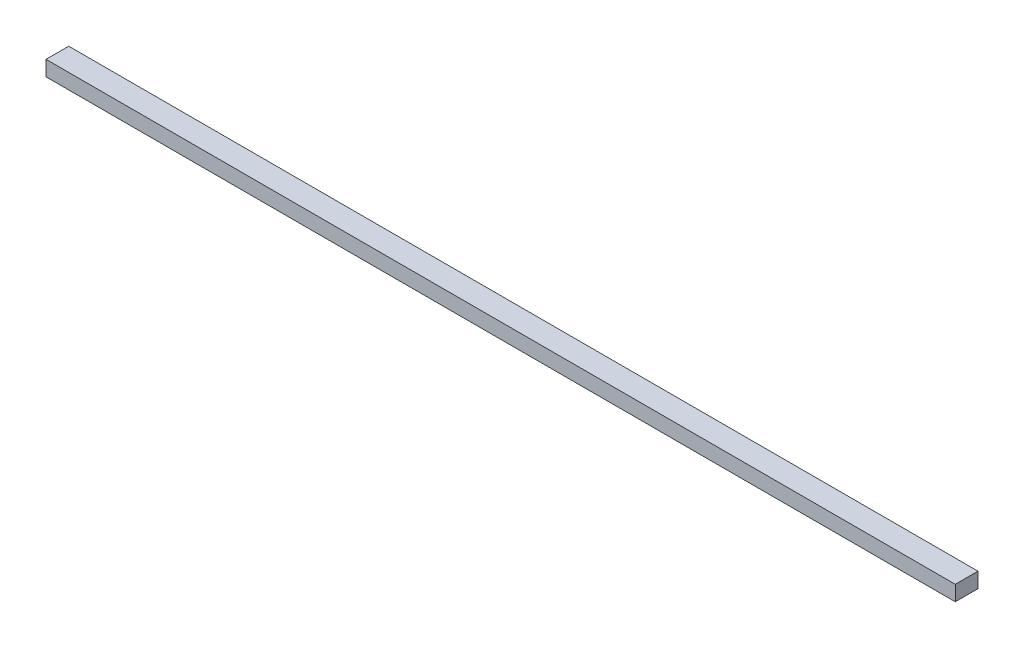
ISO-10303-21;
HEADER;
FILE_DESCRIPTION(('STEP AP214'),'2;1');
FILE_NAME('part.step','',(''),(''),'','','');
FILE_SCHEMA(('AUTOMOTIVE_DESIGN { 1 0 10303 214 1 1 1 1 }'));
ENDSEC;
DATA;
#1=APPLICATION_CONTEXT('core data for automotive mechanical design processes');
#2=APPLICATION_PROTOCOL_DEFINITION('international standard','automotive_design',2000,#1);
#3=PRODUCT_CONTEXT('',#1,'mechanical');
#4=PRODUCT('Part','Part','',(#3));
#5=PRODUCT_RELATED_PRODUCT_CATEGORY('part','',(#4));
#6=PRODUCT_DEFINITION_FORMATION('','',#4);
#7=PRODUCT_DEFINITION_CONTEXT('part definition',#1,'design');
#8=PRODUCT_DEFINITION('design','',#6,#7);
#9=PRODUCT_DEFINITION_SHAPE('','',#8);
#10=(LENGTH_UNIT() NAMED_UNIT(*) SI_UNIT(.MILLI.,.METRE.));
#11=(NAMED_UNIT(*) PLANE_ANGLE_UNIT() SI_UNIT($,.RADIAN.));
#12=(NAMED_UNIT(*) SI_UNIT($,.STERADIAN.) SOLID_ANGLE_UNIT());
#13=UNCERTAINTY_MEASURE_WITH_UNIT(LENGTH_MEASURE(1.E-05),#10,'distance_accuracy_value','');
#14=(GEOMETRIC_REPRESENTATION_CONTEXT(3) GLOBAL_UNCERTAINTY_ASSIGNED_CONTEXT((#13)) GLOBAL_UNIT_ASSIGNED_CONTEXT((#10,
#11,#12)) REPRESENTATION_CONTEXT('',''));
#15=CARTESIAN_POINT('',(0.,0.,0.));
#16=DIRECTION('',(0.,0.,1.));
#17=DIRECTION('',(1.,0.,0.));
#18=AXIS2_PLACEMENT_3D('',#15,#16,#17);
#19=CARTESIAN_POINT('',(0.,10.,0.));
#20=DIRECTION('',(1.,0.,0.));
#21=DIRECTION('',(0.,0.,-1.));
#22=AXIS2_PLACEMENT_3D('',#19,#20,#21);
#23=PLANE('',#22);
#24=DIRECTION('',(0.,0.,1.));
#25=VECTOR('',#24,1.);
#26=CARTESIAN_POINT('',(0.,0.,0.));
#27=LINE('',#26,#25);
#28=CARTESIAN_POINT('',(0.,0.,0.));
#29=VERTEX_POINT('',#28);
#30=CARTESIAN_POINT('',(0.,0.,15.));
#31=VERTEX_POINT('',#30);
#32=EDGE_CURVE('E107',#29,#31,#27,.T.);
#33=ORIENTED_EDGE('',*,*,#32,.T.);
#34=DIRECTION('',(0.,-1.,0.));
#35=VECTOR('',#34,1.);
#36=CARTESIAN_POINT('',(0.,10.,15.));
#37=LINE('',#36,#35);
#38=CARTESIAN_POINT('',(0.,10.,15.));
#39=VERTEX_POINT('',#38);
#40=EDGE_CURVE('E11',#39,#31,#37,.T.);
#41=ORIENTED_EDGE('',*,*,#40,.F.);
#42=DIRECTION('',(0.,0.,1.));
#43=VECTOR('',#42,1.);
#44=CARTESIAN_POINT('',(0.,10.,0.));
#45=LINE('',#44,#43);
#46=CARTESIAN_POINT('',(0.,10.,0.));
#47=VERTEX_POINT('',#46);
#48=EDGE_CURVE('E91',#47,#39,#45,.T.);
#49=ORIENTED_EDGE('',*,*,#48,.F.);
#50=DIRECTION('',(0.,-1.,0.));
#51=VECTOR('',#50,1.);
#52=CARTESIAN_POINT('',(0.,10.,0.));
#53=LINE('',#52,#51);
#54=EDGE_CURVE('E103',#47,#29,#53,.T.);
#55=ORIENTED_EDGE('',*,*,#54,.T.);
#56=EDGE_LOOP('',(#33,#41,#49,#55));
#57=FACE_BOUND('',#56,.T.);
#58=ADVANCED_FACE('F39',(#57),#23,.F.);
#59=CARTESIAN_POINT('',(0.,10.,15.));
#60=DIRECTION('',(0.,0.,-1.));
#61=DIRECTION('',(-1.,0.,0.));
#62=AXIS2_PLACEMENT_3D('',#59,#60,#61);
#63=PLANE('',#62);
#64=DIRECTION('',(1.,0.,0.));
#65=VECTOR('',#64,1.);
#66=CARTESIAN_POINT('',(0.,0.,15.));
#67=LINE('',#66,#65);
#68=CARTESIAN_POINT('',(600.,0.,15.));
#69=VERTEX_POINT('',#68);
#70=EDGE_CURVE('E96',#31,#69,#67,.T.);
#71=ORIENTED_EDGE('',*,*,#70,.T.);
#72=DIRECTION('',(0.,-1.,0.));
#73=VECTOR('',#72,1.);
#74=CARTESIAN_POINT('',(600.,10.,15.));
#75=LINE('',#74,#73);
#76=CARTESIAN_POINT('',(600.,10.,15.));
#77=VERTEX_POINT('',#76);
#78=EDGE_CURVE('E48',#77,#69,#75,.T.);
#79=ORIENTED_EDGE('',*,*,#78,.F.);
#80=DIRECTION('',(1.,0.,0.));
#81=VECTOR('',#80,1.);
#82=CARTESIAN_POINT('',(0.,10.,15.));
#83=LINE('',#82,#81);
#84=EDGE_CURVE('E86',#39,#77,#83,.T.);
#85=ORIENTED_EDGE('',*,*,#84,.F.);
#86=ORIENTED_EDGE('',*,*,#40,.T.);
#87=EDGE_LOOP('',(#71,#79,#85,#86));
#88=FACE_BOUND('',#87,.T.);
#89=ADVANCED_FACE('F95',(#88),#63,.F.);
#90=CARTESIAN_POINT('',(600.,10.,0.));
#91=DIRECTION('',(-1.,0.,0.));
#92=DIRECTION('',(0.,0.,1.));
#93=AXIS2_PLACEMENT_3D('',#90,#91,#92);
#94=PLANE('',#93);
#95=DIRECTION('',(0.,0.,-1.));
#96=VECTOR('',#95,1.);
#97=CARTESIAN_POINT('',(600.,0.,0.));
#98=LINE('',#97,#96);
#99=CARTESIAN_POINT('',(600.,0.,0.));
#100=VERTEX_POINT('',#99);
#101=EDGE_CURVE('E73',#69,#100,#98,.T.);
#102=ORIENTED_EDGE('',*,*,#101,.T.);
#103=DIRECTION('',(0.,-1.,0.));
#104=VECTOR('',#103,1.);
#105=CARTESIAN_POINT('',(600.,10.,0.));
#106=LINE('',#105,#104);
#107=CARTESIAN_POINT('',(600.,10.,0.));
#108=VERTEX_POINT('',#107);
#109=EDGE_CURVE('E98',#108,#100,#106,.T.);
#110=ORIENTED_EDGE('',*,*,#109,.F.);
#111=DIRECTION('',(0.,0.,-1.));
#112=VECTOR('',#111,1.);
#113=CARTESIAN_POINT('',(600.,10.,0.));
#114=LINE('',#113,#112);
#115=EDGE_CURVE('E89',#77,#108,#114,.T.);
#116=ORIENTED_EDGE('',*,*,#115,.F.);
#117=ORIENTED_EDGE('',*,*,#78,.T.);
#118=EDGE_LOOP('',(#102,#110,#116,#117));
#119=FACE_BOUND('',#118,.T.);
#120=ADVANCED_FACE('F99',(#119),#94,.F.);
#121=CARTESIAN_POINT('',(0.,10.,0.));
#122=DIRECTION('',(0.,0.,1.));
#123=DIRECTION('',(1.,0.,0.));
#124=AXIS2_PLACEMENT_3D('',#121,#122,#123);
#125=PLANE('',#124);
#126=DIRECTION('',(-1.,0.,0.));
#127=VECTOR('',#126,1.);
#128=CARTESIAN_POINT('',(0.,0.,0.));
#129=LINE('',#128,#127);
#130=EDGE_CURVE('E79',#100,#29,#129,.T.);
#131=ORIENTED_EDGE('',*,*,#130,.T.);
#132=ORIENTED_EDGE('',*,*,#54,.F.);
#133=DIRECTION('',(-1.,0.,0.));
#134=VECTOR('',#133,1.);
#135=CARTESIAN_POINT('',(0.,10.,0.));
#136=LINE('',#135,#134);
#137=EDGE_CURVE('E56',#108,#47,#136,.T.);
#138=ORIENTED_EDGE('',*,*,#137,.F.);
#139=ORIENTED_EDGE('',*,*,#109,.T.);
#140=EDGE_LOOP('',(#131,#132,#138,#139));
#141=FACE_BOUND('',#140,.T.);
#142=ADVANCED_FACE('F120',(#141),#125,.F.);
#143=CARTESIAN_POINT('',(0.,10.,0.));
#144=DIRECTION('',(0.,1.,0.));
#145=DIRECTION('',(0.,0.,1.));
#146=AXIS2_PLACEMENT_3D('',#143,#144,#145);
#147=PLANE('',#146);
#148=ORIENTED_EDGE('',*,*,#48,.T.);
#149=ORIENTED_EDGE('',*,*,#84,.T.);
#150=ORIENTED_EDGE('',*,*,#115,.T.);
#151=ORIENTED_EDGE('',*,*,#137,.T.);
#152=EDGE_LOOP('',(#148,#149,#150,#151));
#153=FACE_BOUND('',#152,.T.);
#154=ADVANCED_FACE('F87',(#153),#147,.T.);
#155=CARTESIAN_POINT('',(0.,0.,0.));
#156=DIRECTION('',(0.,1.,0.));
#157=DIRECTION('',(0.,0.,1.));
#158=AXIS2_PLACEMENT_3D('',#155,#156,#157);
#159=PLANE('',#158);
#160=ORIENTED_EDGE('',*,*,#32,.F.);
#161=ORIENTED_EDGE('',*,*,#130,.F.);
#162=ORIENTED_EDGE('',*,*,#101,.F.);
#163=ORIENTED_EDGE('',*,*,#70,.F.);
#164=EDGE_LOOP('',(#160,#161,#162,#163));
#165=FACE_BOUND('',#164,.T.);
#166=ADVANCED_FACE('F123',(#165),#159,.F.);
#167=CLOSED_SHELL('',(#58,#89,#120,#142,#154,#166));
#168=MANIFOLD_SOLID_BREP('B2',#167);
#169=ADVANCED_BREP_SHAPE_REPRESENTATION('',(#18,#168),#14);
#170=SHAPE_DEFINITION_REPRESENTATION(#9,#169);
ENDSEC;
END-ISO-10303-21;
